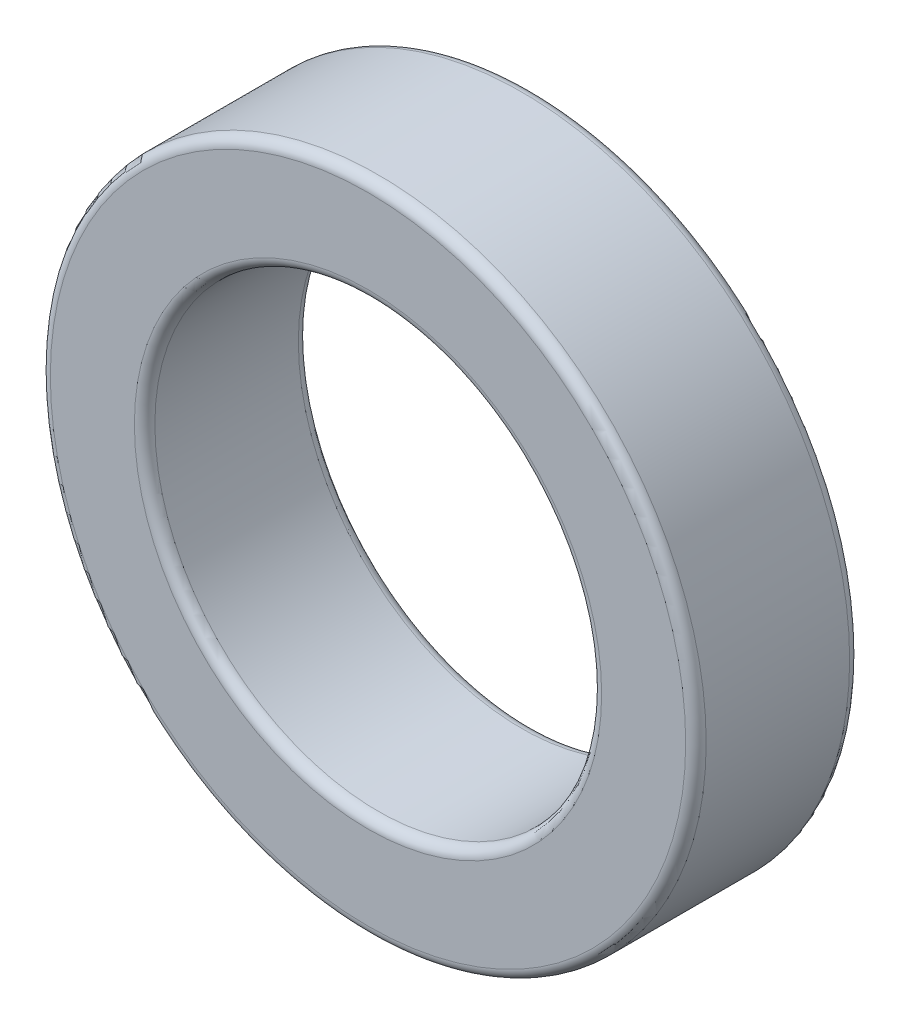
ISO-10303-21;
HEADER;
FILE_DESCRIPTION(('STEP AP214'),'2;1');
FILE_NAME('part.step','',(''),(''),'','','');
FILE_SCHEMA(('AUTOMOTIVE_DESIGN { 1 0 10303 214 1 1 1 1 }'));
ENDSEC;
DATA;
#1=APPLICATION_CONTEXT('core data for automotive mechanical design processes');
#2=APPLICATION_PROTOCOL_DEFINITION('international standard','automotive_design',2000,#1);
#3=PRODUCT_CONTEXT('',#1,'mechanical');
#4=PRODUCT('Part','Part','',(#3));
#5=PRODUCT_RELATED_PRODUCT_CATEGORY('part','',(#4));
#6=PRODUCT_DEFINITION_FORMATION('','',#4);
#7=PRODUCT_DEFINITION_CONTEXT('part definition',#1,'design');
#8=PRODUCT_DEFINITION('design','',#6,#7);
#9=PRODUCT_DEFINITION_SHAPE('','',#8);
#10=(LENGTH_UNIT() NAMED_UNIT(*) SI_UNIT(.MILLI.,.METRE.));
#11=(NAMED_UNIT(*) PLANE_ANGLE_UNIT() SI_UNIT($,.RADIAN.));
#12=(NAMED_UNIT(*) SI_UNIT($,.STERADIAN.) SOLID_ANGLE_UNIT());
#13=UNCERTAINTY_MEASURE_WITH_UNIT(LENGTH_MEASURE(1.E-05),#10,'distance_accuracy_value','');
#14=(GEOMETRIC_REPRESENTATION_CONTEXT(3) GLOBAL_UNCERTAINTY_ASSIGNED_CONTEXT((#13)) GLOBAL_UNIT_ASSIGNED_CONTEXT((#10,
#11,#12)) REPRESENTATION_CONTEXT('',''));
#15=CARTESIAN_POINT('',(0.,0.,0.));
#16=DIRECTION('',(0.,0.,1.));
#17=DIRECTION('',(1.,0.,0.));
#18=AXIS2_PLACEMENT_3D('',#15,#16,#17);
#19=CARTESIAN_POINT('',(0.,0.,8.));
#20=DIRECTION('',(0.,0.,1.));
#21=DIRECTION('',(1.,0.,0.));
#22=AXIS2_PLACEMENT_3D('',#19,#20,#21);
#23=PLANE('',#22);
#24=CARTESIAN_POINT('',(0.,0.,8.));
#25=DIRECTION('',(0.,0.,1.));
#26=DIRECTION('',(1.,0.,0.));
#27=AXIS2_PLACEMENT_3D('',#24,#25,#26);
#28=CIRCLE('',#27,11.4);
#29=CARTESIAN_POINT('',(11.4,0.,8.));
#30=VERTEX_POINT('',#29);
#31=EDGE_CURVE('E42',#30,#30,#28,.F.);
#32=ORIENTED_EDGE('',*,*,#31,.T.);
#33=EDGE_LOOP('',(#32));
#34=FACE_BOUND('',#33,.T.);
#35=CARTESIAN_POINT('',(0.,0.,8.));
#36=DIRECTION('',(0.,0.,1.));
#37=DIRECTION('',(1.,0.,0.));
#38=AXIS2_PLACEMENT_3D('',#35,#36,#37);
#39=CIRCLE('',#38,15.5);
#40=CARTESIAN_POINT('',(15.5,0.,8.));
#41=VERTEX_POINT('',#40);
#42=EDGE_CURVE('E46',#41,#41,#39,.T.);
#43=ORIENTED_EDGE('',*,*,#42,.T.);
#44=EDGE_LOOP('',(#43));
#45=FACE_BOUND('',#44,.T.);
#46=ADVANCED_FACE('F31',(#34,#45),#23,.T.);
#47=CARTESIAN_POINT('',(0.,0.,0.));
#48=DIRECTION('',(0.,0.,1.));
#49=DIRECTION('',(1.,0.,0.));
#50=AXIS2_PLACEMENT_3D('',#47,#48,#49);
#51=PLANE('',#50);
#52=CARTESIAN_POINT('',(0.,0.,0.));
#53=DIRECTION('',(0.,0.,1.));
#54=DIRECTION('',(1.,0.,0.));
#55=AXIS2_PLACEMENT_3D('',#52,#53,#54);
#56=CIRCLE('',#55,11.4);
#57=CARTESIAN_POINT('',(11.4,0.,0.));
#58=VERTEX_POINT('',#57);
#59=EDGE_CURVE('E57',#58,#58,#56,.T.);
#60=ORIENTED_EDGE('',*,*,#59,.T.);
#61=EDGE_LOOP('',(#60));
#62=FACE_BOUND('',#61,.T.);
#63=CARTESIAN_POINT('',(0.,0.,0.));
#64=DIRECTION('',(0.,0.,1.));
#65=DIRECTION('',(1.,0.,0.));
#66=AXIS2_PLACEMENT_3D('',#63,#64,#65);
#67=CIRCLE('',#66,15.5);
#68=CARTESIAN_POINT('',(15.5,0.,0.));
#69=VERTEX_POINT('',#68);
#70=EDGE_CURVE('E60',#69,#69,#67,.F.);
#71=ORIENTED_EDGE('',*,*,#70,.T.);
#72=EDGE_LOOP('',(#71));
#73=FACE_BOUND('',#72,.T.);
#74=ADVANCED_FACE('F64',(#62,#73),#51,.F.);
#75=CARTESIAN_POINT('',(0.,0.,8.));
#76=DIRECTION('',(0.,0.,-1.));
#77=DIRECTION('',(-1.,0.,0.));
#78=AXIS2_PLACEMENT_3D('',#75,#76,#77);
#79=CYLINDRICAL_SURFACE('',#78,16.);
#80=CARTESIAN_POINT('',(0.,0.,0.5));
#81=DIRECTION('',(0.,0.,1.));
#82=DIRECTION('',(1.,0.,0.));
#83=AXIS2_PLACEMENT_3D('',#80,#81,#82);
#84=CIRCLE('',#83,16.);
#85=CARTESIAN_POINT('',(16.,0.,0.5));
#86=VERTEX_POINT('',#85);
#87=EDGE_CURVE('E10',#86,#86,#84,.T.);
#88=ORIENTED_EDGE('',*,*,#87,.T.);
#89=EDGE_LOOP('',(#88));
#90=FACE_BOUND('',#89,.T.);
#91=CARTESIAN_POINT('',(0.,0.,7.5));
#92=DIRECTION('',(0.,0.,1.));
#93=DIRECTION('',(1.,0.,0.));
#94=AXIS2_PLACEMENT_3D('',#91,#92,#93);
#95=CIRCLE('',#94,16.);
#96=CARTESIAN_POINT('',(16.,0.,7.5));
#97=VERTEX_POINT('',#96);
#98=EDGE_CURVE('E38',#97,#97,#95,.F.);
#99=ORIENTED_EDGE('',*,*,#98,.T.);
#100=EDGE_LOOP('',(#99));
#101=FACE_BOUND('',#100,.T.);
#102=ADVANCED_FACE('F84',(#90,#101),#79,.T.);
#103=CARTESIAN_POINT('',(0.,0.,8.));
#104=DIRECTION('',(0.,0.,-1.));
#105=DIRECTION('',(-1.,0.,0.));
#106=AXIS2_PLACEMENT_3D('',#103,#104,#105);
#107=CYLINDRICAL_SURFACE('',#106,10.9);
#108=CARTESIAN_POINT('',(0.,0.,0.5));
#109=DIRECTION('',(0.,0.,1.));
#110=DIRECTION('',(1.,0.,0.));
#111=AXIS2_PLACEMENT_3D('',#108,#109,#110);
#112=CIRCLE('',#111,10.9);
#113=CARTESIAN_POINT('',(10.9,0.,0.5));
#114=VERTEX_POINT('',#113);
#115=EDGE_CURVE('E51',#114,#114,#112,.F.);
#116=ORIENTED_EDGE('',*,*,#115,.T.);
#117=EDGE_LOOP('',(#116));
#118=FACE_BOUND('',#117,.T.);
#119=CARTESIAN_POINT('',(0.,0.,7.5));
#120=DIRECTION('',(0.,0.,1.));
#121=DIRECTION('',(1.,0.,0.));
#122=AXIS2_PLACEMENT_3D('',#119,#120,#121);
#123=CIRCLE('',#122,10.9);
#124=CARTESIAN_POINT('',(10.9,0.,7.5));
#125=VERTEX_POINT('',#124);
#126=EDGE_CURVE('E54',#125,#125,#123,.T.);
#127=ORIENTED_EDGE('',*,*,#126,.T.);
#128=EDGE_LOOP('',(#127));
#129=FACE_BOUND('',#128,.T.);
#130=ADVANCED_FACE('F89',(#118,#129),#107,.F.);
#131=CARTESIAN_POINT('',(0.,0.,0.5));
#132=DIRECTION('',(0.,0.,1.));
#133=DIRECTION('',(1.,0.,0.));
#134=AXIS2_PLACEMENT_3D('',#131,#132,#133);
#135=TOROIDAL_SURFACE('',#134,11.4,0.5);
#136=ORIENTED_EDGE('',*,*,#115,.F.);
#137=EDGE_LOOP('',(#136));
#138=FACE_BOUND('',#137,.T.);
#139=ORIENTED_EDGE('',*,*,#59,.F.);
#140=EDGE_LOOP('',(#139));
#141=FACE_BOUND('',#140,.T.);
#142=ADVANCED_FACE('F75',(#138,#141),#135,.T.);
#143=CARTESIAN_POINT('',(0.,0.,7.5));
#144=DIRECTION('',(0.,0.,1.));
#145=DIRECTION('',(1.,0.,0.));
#146=AXIS2_PLACEMENT_3D('',#143,#144,#145);
#147=TOROIDAL_SURFACE('',#146,11.4,0.5);
#148=ORIENTED_EDGE('',*,*,#31,.F.);
#149=EDGE_LOOP('',(#148));
#150=FACE_BOUND('',#149,.T.);
#151=ORIENTED_EDGE('',*,*,#126,.F.);
#152=EDGE_LOOP('',(#151));
#153=FACE_BOUND('',#152,.T.);
#154=ADVANCED_FACE('F69',(#150,#153),#147,.T.);
#155=CARTESIAN_POINT('',(0.,0.,0.5));
#156=DIRECTION('',(0.,0.,1.));
#157=DIRECTION('',(1.,0.,0.));
#158=AXIS2_PLACEMENT_3D('',#155,#156,#157);
#159=TOROIDAL_SURFACE('',#158,15.5,0.5);
#160=ORIENTED_EDGE('',*,*,#70,.F.);
#161=EDGE_LOOP('',(#160));
#162=FACE_BOUND('',#161,.T.);
#163=ORIENTED_EDGE('',*,*,#87,.F.);
#164=EDGE_LOOP('',(#163));
#165=FACE_BOUND('',#164,.T.);
#166=ADVANCED_FACE('F66',(#162,#165),#159,.T.);
#167=CARTESIAN_POINT('',(0.,0.,7.5));
#168=DIRECTION('',(0.,0.,1.));
#169=DIRECTION('',(1.,0.,0.));
#170=AXIS2_PLACEMENT_3D('',#167,#168,#169);
#171=TOROIDAL_SURFACE('',#170,15.5,0.5);
#172=ORIENTED_EDGE('',*,*,#98,.F.);
#173=EDGE_LOOP('',(#172));
#174=FACE_BOUND('',#173,.T.);
#175=ORIENTED_EDGE('',*,*,#42,.F.);
#176=EDGE_LOOP('',(#175));
#177=FACE_BOUND('',#176,.T.);
#178=ADVANCED_FACE('F33',(#174,#177),#171,.T.);
#179=CLOSED_SHELL('',(#46,#74,#102,#130,#142,#154,#166,#178));
#180=MANIFOLD_SOLID_BREP('B2',#179);
#181=ADVANCED_BREP_SHAPE_REPRESENTATION('',(#18,#180),#14);
#182=SHAPE_DEFINITION_REPRESENTATION(#9,#181);
ENDSEC;
END-ISO-10303-21;
